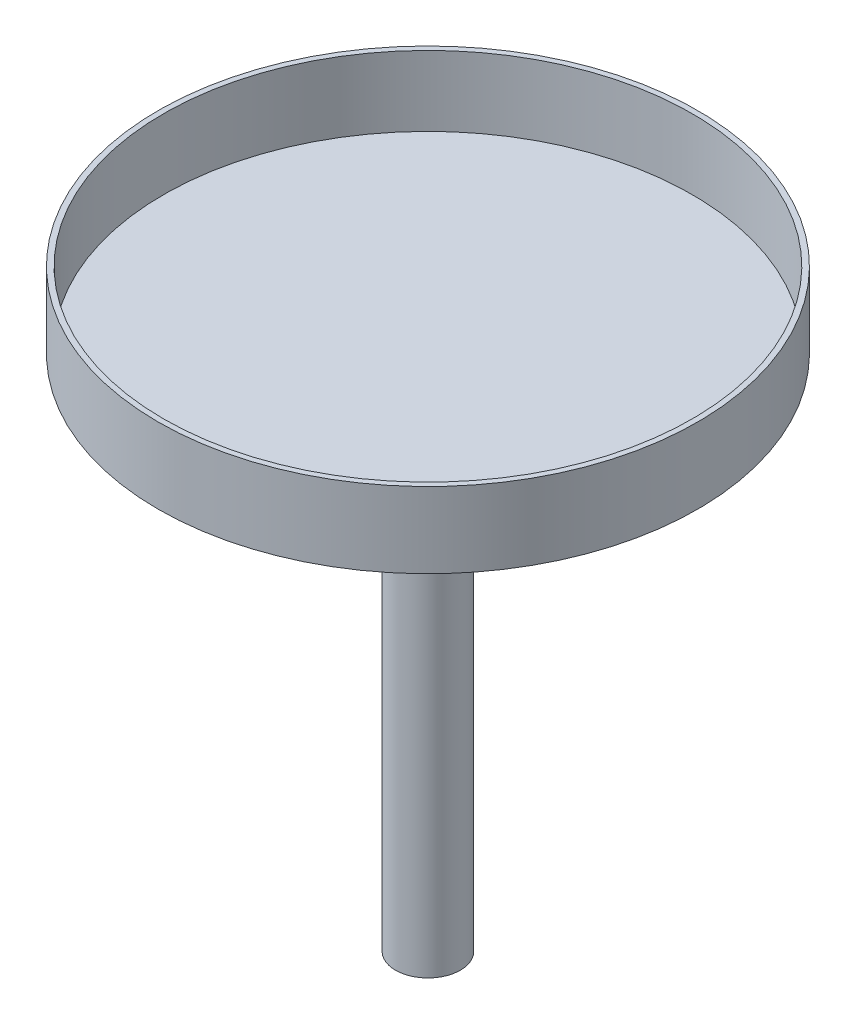
ISO-10303-21;
HEADER;
FILE_DESCRIPTION(('STEP AP214'),'2;1');
FILE_NAME('part.step','',(''),(''),'','','');
FILE_SCHEMA(('AUTOMOTIVE_DESIGN { 1 0 10303 214 1 1 1 1 }'));
ENDSEC;
DATA;
#1=APPLICATION_CONTEXT('core data for automotive mechanical design processes');
#2=APPLICATION_PROTOCOL_DEFINITION('international standard','automotive_design',2000,#1);
#3=PRODUCT_CONTEXT('',#1,'mechanical');
#4=PRODUCT('Part','Part','',(#3));
#5=PRODUCT_RELATED_PRODUCT_CATEGORY('part','',(#4));
#6=PRODUCT_DEFINITION_FORMATION('','',#4);
#7=PRODUCT_DEFINITION_CONTEXT('part definition',#1,'design');
#8=PRODUCT_DEFINITION('design','',#6,#7);
#9=PRODUCT_DEFINITION_SHAPE('','',#8);
#10=(LENGTH_UNIT() NAMED_UNIT(*) SI_UNIT(.MILLI.,.METRE.));
#11=(NAMED_UNIT(*) PLANE_ANGLE_UNIT() SI_UNIT($,.RADIAN.));
#12=(NAMED_UNIT(*) SI_UNIT($,.STERADIAN.) SOLID_ANGLE_UNIT());
#13=UNCERTAINTY_MEASURE_WITH_UNIT(LENGTH_MEASURE(1.E-05),#10,'distance_accuracy_value','');
#14=(GEOMETRIC_REPRESENTATION_CONTEXT(3) GLOBAL_UNCERTAINTY_ASSIGNED_CONTEXT((#13)) GLOBAL_UNIT_ASSIGNED_CONTEXT((#10,
#11,#12)) REPRESENTATION_CONTEXT('',''));
#15=CARTESIAN_POINT('',(0.,0.,0.));
#16=DIRECTION('',(0.,0.,1.));
#17=DIRECTION('',(1.,0.,0.));
#18=AXIS2_PLACEMENT_3D('',#15,#16,#17);
#19=CARTESIAN_POINT('',(0.,-480.,0.));
#20=DIRECTION('',(0.,1.,0.));
#21=DIRECTION('',(0.,0.,1.));
#22=AXIS2_PLACEMENT_3D('',#19,#20,#21);
#23=PLANE('',#22);
#24=CARTESIAN_POINT('',(0.,-480.,0.));
#25=DIRECTION('',(0.,1.,0.));
#26=DIRECTION('',(0.,0.,1.));
#27=AXIS2_PLACEMENT_3D('',#24,#25,#26);
#28=CIRCLE('',#27,30.);
#29=CARTESIAN_POINT('',(0.,-480.,30.));
#30=VERTEX_POINT('',#29);
#31=EDGE_CURVE('E10',#30,#30,#28,.T.);
#32=ORIENTED_EDGE('',*,*,#31,.F.);
#33=EDGE_LOOP('',(#32));
#34=FACE_BOUND('',#33,.T.);
#35=ADVANCED_FACE('F37',(#34),#23,.F.);
#36=CARTESIAN_POINT('',(0.,40.9285714285713,0.));
#37=DIRECTION('',(0.,1.,0.));
#38=DIRECTION('',(0.,0.,1.));
#39=AXIS2_PLACEMENT_3D('',#36,#37,#38);
#40=CYLINDRICAL_SURFACE('',#39,30.);
#41=CARTESIAN_POINT('',(0.,0.,0.));
#42=DIRECTION('',(0.,1.,0.));
#43=DIRECTION('',(0.,0.,1.));
#44=AXIS2_PLACEMENT_3D('',#41,#42,#43);
#45=CIRCLE('',#44,30.);
#46=CARTESIAN_POINT('',(0.,0.,30.));
#47=VERTEX_POINT('',#46);
#48=EDGE_CURVE('E43',#47,#47,#45,.T.);
#49=ORIENTED_EDGE('',*,*,#48,.F.);
#50=EDGE_LOOP('',(#49));
#51=FACE_BOUND('',#50,.T.);
#52=ORIENTED_EDGE('',*,*,#31,.T.);
#53=EDGE_LOOP('',(#52));
#54=FACE_BOUND('',#53,.T.);
#55=ADVANCED_FACE('F85',(#51,#54),#40,.T.);
#56=CARTESIAN_POINT('',(30.,0.,0.));
#57=DIRECTION('',(0.,1.,0.));
#58=DIRECTION('',(0.,0.,1.));
#59=AXIS2_PLACEMENT_3D('',#56,#57,#58);
#60=PLANE('',#59);
#61=CARTESIAN_POINT('',(0.,0.,0.));
#62=DIRECTION('',(0.,1.,0.));
#63=DIRECTION('',(0.,0.,1.));
#64=AXIS2_PLACEMENT_3D('',#61,#62,#63);
#65=CIRCLE('',#64,250.);
#66=CARTESIAN_POINT('',(0.,0.,250.));
#67=VERTEX_POINT('',#66);
#68=EDGE_CURVE('E47',#67,#67,#65,.T.);
#69=ORIENTED_EDGE('',*,*,#68,.F.);
#70=EDGE_LOOP('',(#69));
#71=FACE_BOUND('',#70,.T.);
#72=ORIENTED_EDGE('',*,*,#48,.T.);
#73=EDGE_LOOP('',(#72));
#74=FACE_BOUND('',#73,.T.);
#75=ADVANCED_FACE('F80',(#71,#74),#60,.F.);
#76=CARTESIAN_POINT('',(0.,40.9285714285713,0.));
#77=DIRECTION('',(0.,1.,0.));
#78=DIRECTION('',(0.,0.,1.));
#79=AXIS2_PLACEMENT_3D('',#76,#77,#78);
#80=CYLINDRICAL_SURFACE('',#79,250.);
#81=CARTESIAN_POINT('',(0.,70.,0.));
#82=DIRECTION('',(0.,1.,0.));
#83=DIRECTION('',(0.,0.,1.));
#84=AXIS2_PLACEMENT_3D('',#81,#82,#83);
#85=CIRCLE('',#84,250.);
#86=CARTESIAN_POINT('',(0.,70.,250.));
#87=VERTEX_POINT('',#86);
#88=EDGE_CURVE('E51',#87,#87,#85,.T.);
#89=ORIENTED_EDGE('',*,*,#88,.F.);
#90=EDGE_LOOP('',(#89));
#91=FACE_BOUND('',#90,.T.);
#92=ORIENTED_EDGE('',*,*,#68,.T.);
#93=EDGE_LOOP('',(#92));
#94=FACE_BOUND('',#93,.T.);
#95=ADVANCED_FACE('F74',(#91,#94),#80,.T.);
#96=CARTESIAN_POINT('',(250.,70.,0.));
#97=DIRECTION('',(0.,-1.,0.));
#98=DIRECTION('',(0.,0.,-1.));
#99=AXIS2_PLACEMENT_3D('',#96,#97,#98);
#100=PLANE('',#99);
#101=CARTESIAN_POINT('',(0.,70.,0.));
#102=DIRECTION('',(0.,1.,0.));
#103=DIRECTION('',(0.,0.,1.));
#104=AXIS2_PLACEMENT_3D('',#101,#102,#103);
#105=CIRCLE('',#104,245.);
#106=CARTESIAN_POINT('',(0.,70.,245.));
#107=VERTEX_POINT('',#106);
#108=EDGE_CURVE('E56',#107,#107,#105,.T.);
#109=ORIENTED_EDGE('',*,*,#108,.F.);
#110=EDGE_LOOP('',(#109));
#111=FACE_BOUND('',#110,.T.);
#112=ORIENTED_EDGE('',*,*,#88,.T.);
#113=EDGE_LOOP('',(#112));
#114=FACE_BOUND('',#113,.T.);
#115=ADVANCED_FACE('F68',(#111,#114),#100,.F.);
#116=CARTESIAN_POINT('',(0.,40.9285714285713,0.));
#117=DIRECTION('',(0.,1.,0.));
#118=DIRECTION('',(0.,0.,1.));
#119=AXIS2_PLACEMENT_3D('',#116,#117,#118);
#120=CYLINDRICAL_SURFACE('',#119,245.);
#121=CARTESIAN_POINT('',(0.,5.00000000000002,0.));
#122=DIRECTION('',(0.,1.,0.));
#123=DIRECTION('',(0.,0.,1.));
#124=AXIS2_PLACEMENT_3D('',#121,#122,#123);
#125=CIRCLE('',#124,245.);
#126=CARTESIAN_POINT('',(0.,5.00000000000002,245.));
#127=VERTEX_POINT('',#126);
#128=EDGE_CURVE('E59',#127,#127,#125,.T.);
#129=ORIENTED_EDGE('',*,*,#128,.F.);
#130=EDGE_LOOP('',(#129));
#131=FACE_BOUND('',#130,.T.);
#132=ORIENTED_EDGE('',*,*,#108,.T.);
#133=EDGE_LOOP('',(#132));
#134=FACE_BOUND('',#133,.T.);
#135=ADVANCED_FACE('F65',(#131,#134),#120,.F.);
#136=CARTESIAN_POINT('',(245.,5.00000000000001,0.));
#137=DIRECTION('',(0.,-1.,0.));
#138=DIRECTION('',(0.,0.,-1.));
#139=AXIS2_PLACEMENT_3D('',#136,#137,#138);
#140=PLANE('',#139);
#141=ORIENTED_EDGE('',*,*,#128,.T.);
#142=EDGE_LOOP('',(#141));
#143=FACE_BOUND('',#142,.T.);
#144=ADVANCED_FACE('F63',(#143),#140,.F.);
#145=CLOSED_SHELL('',(#35,#55,#75,#95,#115,#135,#144));
#146=MANIFOLD_SOLID_BREP('B2',#145);
#147=ADVANCED_BREP_SHAPE_REPRESENTATION('',(#18,#146),#14);
#148=SHAPE_DEFINITION_REPRESENTATION(#9,#147);
ENDSEC;
END-ISO-10303-21;
